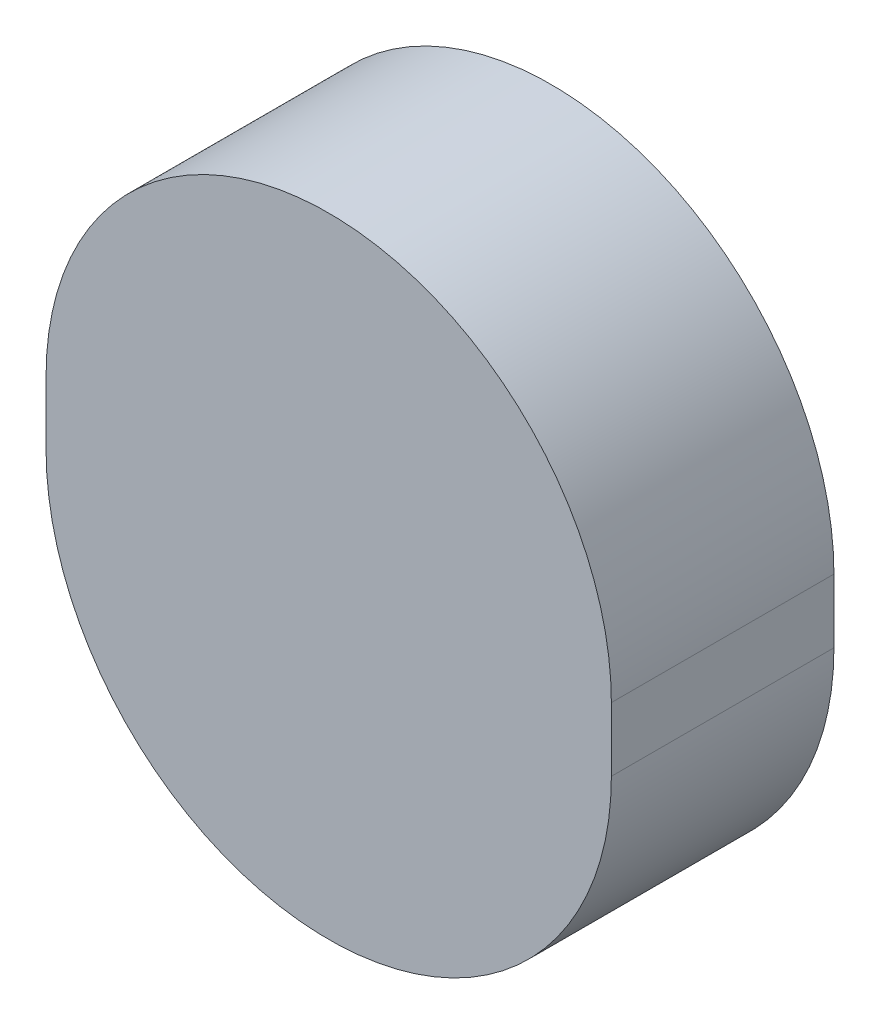
ISO-10303-21;
HEADER;
FILE_DESCRIPTION(('STEP AP214'),'2;1');
FILE_NAME('part.step','',(''),(''),'','','');
FILE_SCHEMA(('AUTOMOTIVE_DESIGN { 1 0 10303 214 1 1 1 1 }'));
ENDSEC;
DATA;
#1=APPLICATION_CONTEXT('core data for automotive mechanical design processes');
#2=APPLICATION_PROTOCOL_DEFINITION('international standard','automotive_design',2000,#1);
#3=PRODUCT_CONTEXT('',#1,'mechanical');
#4=PRODUCT('Part','Part','',(#3));
#5=PRODUCT_RELATED_PRODUCT_CATEGORY('part','',(#4));
#6=PRODUCT_DEFINITION_FORMATION('','',#4);
#7=PRODUCT_DEFINITION_CONTEXT('part definition',#1,'design');
#8=PRODUCT_DEFINITION('design','',#6,#7);
#9=PRODUCT_DEFINITION_SHAPE('','',#8);
#10=(LENGTH_UNIT() NAMED_UNIT(*) SI_UNIT(.MILLI.,.METRE.));
#11=(NAMED_UNIT(*) PLANE_ANGLE_UNIT() SI_UNIT($,.RADIAN.));
#12=(NAMED_UNIT(*) SI_UNIT($,.STERADIAN.) SOLID_ANGLE_UNIT());
#13=UNCERTAINTY_MEASURE_WITH_UNIT(LENGTH_MEASURE(1.E-05),#10,'distance_accuracy_value','');
#14=(GEOMETRIC_REPRESENTATION_CONTEXT(3) GLOBAL_UNCERTAINTY_ASSIGNED_CONTEXT((#13)) GLOBAL_UNIT_ASSIGNED_CONTEXT((#10,
#11,#12)) REPRESENTATION_CONTEXT('',''));
#15=CARTESIAN_POINT('',(0.,0.,0.));
#16=DIRECTION('',(0.,0.,1.));
#17=DIRECTION('',(1.,0.,0.));
#18=AXIS2_PLACEMENT_3D('',#15,#16,#17);
#19=CARTESIAN_POINT('',(138.49500114,65.22825918,0.));
#20=DIRECTION('',(-1.,0.,0.));
#21=DIRECTION('',(0.,1.,0.));
#22=AXIS2_PLACEMENT_3D('',#19,#20,#21);
#23=PLANE('',#22);
#24=DIRECTION('',(0.,1.,0.));
#25=VECTOR('',#24,1.);
#26=CARTESIAN_POINT('',(138.49500114,65.22825918,0.1999996));
#27=LINE('',#26,#25);
#28=CARTESIAN_POINT('',(138.49500114,65.22825918,0.1999996));
#29=VERTEX_POINT('',#28);
#30=CARTESIAN_POINT('',(138.49500114,65.28563016,0.1999996));
#31=VERTEX_POINT('',#30);
#32=EDGE_CURVE('E11',#29,#31,#27,.T.);
#33=ORIENTED_EDGE('',*,*,#32,.F.);
#34=DIRECTION('',(0.,0.,1.));
#35=VECTOR('',#34,1.);
#36=CARTESIAN_POINT('',(138.49500114,65.22825918,0.));
#37=LINE('',#36,#35);
#38=CARTESIAN_POINT('',(138.49500114,65.22825918,0.));
#39=VERTEX_POINT('',#38);
#40=EDGE_CURVE('E24',#39,#29,#37,.T.);
#41=ORIENTED_EDGE('',*,*,#40,.F.);
#42=DIRECTION('',(0.,1.,0.));
#43=VECTOR('',#42,1.);
#44=CARTESIAN_POINT('',(138.49500114,65.22825918,0.));
#45=LINE('',#44,#43);
#46=CARTESIAN_POINT('',(138.49500114,65.28563016,0.));
#47=VERTEX_POINT('',#46);
#48=EDGE_CURVE('E75',#39,#47,#45,.T.);
#49=ORIENTED_EDGE('',*,*,#48,.T.);
#50=DIRECTION('',(0.,0.,1.));
#51=VECTOR('',#50,1.);
#52=CARTESIAN_POINT('',(138.49500114,65.28563016,0.));
#53=LINE('',#52,#51);
#54=EDGE_CURVE('E37',#47,#31,#53,.T.);
#55=ORIENTED_EDGE('',*,*,#54,.T.);
#56=EDGE_LOOP('',(#33,#41,#49,#55));
#57=FACE_BOUND('',#56,.T.);
#58=ADVANCED_FACE('F17',(#57),#23,.F.);
#59=CARTESIAN_POINT('',(138.24100114,65.28563016,0.));
#60=DIRECTION('',(0.,0.,-1.));
#61=DIRECTION('',(1.,0.,0.));
#62=AXIS2_PLACEMENT_3D('',#59,#60,#61);
#63=CYLINDRICAL_SURFACE('',#62,0.254000000000005);
#64=CARTESIAN_POINT('',(138.24100114,65.28563016,0.1999996));
#65=DIRECTION('',(0.,0.,1.));
#66=DIRECTION('',(1.,0.,0.));
#67=AXIS2_PLACEMENT_3D('',#64,#65,#66);
#68=CIRCLE('',#67,0.254000000000005);
#69=CARTESIAN_POINT('',(137.98700114,65.28563016,0.1999996));
#70=VERTEX_POINT('',#69);
#71=EDGE_CURVE('E83',#31,#70,#68,.T.);
#72=ORIENTED_EDGE('',*,*,#71,.F.);
#73=ORIENTED_EDGE('',*,*,#54,.F.);
#74=CARTESIAN_POINT('',(138.24100114,65.28563016,0.));
#75=DIRECTION('',(0.,0.,1.));
#76=DIRECTION('',(1.,0.,0.));
#77=AXIS2_PLACEMENT_3D('',#74,#75,#76);
#78=CIRCLE('',#77,0.254000000000005);
#79=CARTESIAN_POINT('',(137.98700114,65.28563016,0.));
#80=VERTEX_POINT('',#79);
#81=EDGE_CURVE('E81',#47,#80,#78,.T.);
#82=ORIENTED_EDGE('',*,*,#81,.T.);
#83=DIRECTION('',(0.,0.,1.));
#84=VECTOR('',#83,1.);
#85=CARTESIAN_POINT('',(137.98700114,65.28563016,0.));
#86=LINE('',#85,#84);
#87=EDGE_CURVE('E67',#80,#70,#86,.T.);
#88=ORIENTED_EDGE('',*,*,#87,.T.);
#89=EDGE_LOOP('',(#72,#73,#82,#88));
#90=FACE_BOUND('',#89,.T.);
#91=ADVANCED_FACE('F89',(#90),#63,.T.);
#92=CARTESIAN_POINT('',(137.98700114,65.28563016,0.));
#93=DIRECTION('',(1.,0.,0.));
#94=DIRECTION('',(0.,-1.,0.));
#95=AXIS2_PLACEMENT_3D('',#92,#93,#94);
#96=PLANE('',#95);
#97=DIRECTION('',(0.,-1.,0.));
#98=VECTOR('',#97,1.);
#99=CARTESIAN_POINT('',(137.98700114,65.28563016,0.1999996));
#100=LINE('',#99,#98);
#101=CARTESIAN_POINT('',(137.98700114,65.22825918,0.1999996));
#102=VERTEX_POINT('',#101);
#103=EDGE_CURVE('E71',#70,#102,#100,.T.);
#104=ORIENTED_EDGE('',*,*,#103,.F.);
#105=ORIENTED_EDGE('',*,*,#87,.F.);
#106=DIRECTION('',(0.,-1.,0.));
#107=VECTOR('',#106,1.);
#108=CARTESIAN_POINT('',(137.98700114,65.28563016,0.));
#109=LINE('',#108,#107);
#110=CARTESIAN_POINT('',(137.98700114,65.22825918,0.));
#111=VERTEX_POINT('',#110);
#112=EDGE_CURVE('E63',#80,#111,#109,.T.);
#113=ORIENTED_EDGE('',*,*,#112,.T.);
#114=DIRECTION('',(0.,0.,1.));
#115=VECTOR('',#114,1.);
#116=CARTESIAN_POINT('',(137.98700114,65.22825918,0.));
#117=LINE('',#116,#115);
#118=EDGE_CURVE('E53',#111,#102,#117,.T.);
#119=ORIENTED_EDGE('',*,*,#118,.T.);
#120=EDGE_LOOP('',(#104,#105,#113,#119));
#121=FACE_BOUND('',#120,.T.);
#122=ADVANCED_FACE('F66',(#121),#96,.F.);
#123=CARTESIAN_POINT('',(138.24100114,65.22825918,0.));
#124=DIRECTION('',(0.,0.,-1.));
#125=DIRECTION('',(-1.,0.,0.));
#126=AXIS2_PLACEMENT_3D('',#123,#124,#125);
#127=CYLINDRICAL_SURFACE('',#126,0.254000000000005);
#128=CARTESIAN_POINT('',(138.24100114,65.22825918,0.1999996));
#129=DIRECTION('',(0.,0.,1.));
#130=DIRECTION('',(-1.,0.,0.));
#131=AXIS2_PLACEMENT_3D('',#128,#129,#130);
#132=CIRCLE('',#131,0.254000000000005);
#133=EDGE_CURVE('E59',#102,#29,#132,.T.);
#134=ORIENTED_EDGE('',*,*,#133,.F.);
#135=ORIENTED_EDGE('',*,*,#118,.F.);
#136=CARTESIAN_POINT('',(138.24100114,65.22825918,0.));
#137=DIRECTION('',(0.,0.,1.));
#138=DIRECTION('',(-1.,0.,0.));
#139=AXIS2_PLACEMENT_3D('',#136,#137,#138);
#140=CIRCLE('',#139,0.254000000000005);
#141=EDGE_CURVE('E57',#111,#39,#140,.T.);
#142=ORIENTED_EDGE('',*,*,#141,.T.);
#143=ORIENTED_EDGE('',*,*,#40,.T.);
#144=EDGE_LOOP('',(#134,#135,#142,#143));
#145=FACE_BOUND('',#144,.T.);
#146=ADVANCED_FACE('F55',(#145),#127,.T.);
#147=CARTESIAN_POINT('',(138.49500114,65.22825918,0.));
#148=DIRECTION('',(0.,0.,-1.));
#149=DIRECTION('',(-1.,0.,0.));
#150=AXIS2_PLACEMENT_3D('',#147,#148,#149);
#151=PLANE('',#150);
#152=ORIENTED_EDGE('',*,*,#141,.F.);
#153=ORIENTED_EDGE('',*,*,#112,.F.);
#154=ORIENTED_EDGE('',*,*,#81,.F.);
#155=ORIENTED_EDGE('',*,*,#48,.F.);
#156=EDGE_LOOP('',(#152,#153,#154,#155));
#157=FACE_BOUND('',#156,.T.);
#158=ADVANCED_FACE('F74',(#157),#151,.T.);
#159=CARTESIAN_POINT('',(138.49500114,65.22825918,0.1999996));
#160=DIRECTION('',(0.,0.,-1.));
#161=DIRECTION('',(-1.,0.,0.));
#162=AXIS2_PLACEMENT_3D('',#159,#160,#161);
#163=PLANE('',#162);
#164=ORIENTED_EDGE('',*,*,#32,.T.);
#165=ORIENTED_EDGE('',*,*,#71,.T.);
#166=ORIENTED_EDGE('',*,*,#103,.T.);
#167=ORIENTED_EDGE('',*,*,#133,.T.);
#168=EDGE_LOOP('',(#164,#165,#166,#167));
#169=FACE_BOUND('',#168,.T.);
#170=ADVANCED_FACE('F91',(#169),#163,.F.);
#171=CLOSED_SHELL('',(#58,#91,#122,#146,#158,#170));
#172=MANIFOLD_SOLID_BREP('B1',#171);
#173=ADVANCED_BREP_SHAPE_REPRESENTATION('',(#18,#172),#14);
#174=SHAPE_DEFINITION_REPRESENTATION(#9,#173);
ENDSEC;
END-ISO-10303-21;
